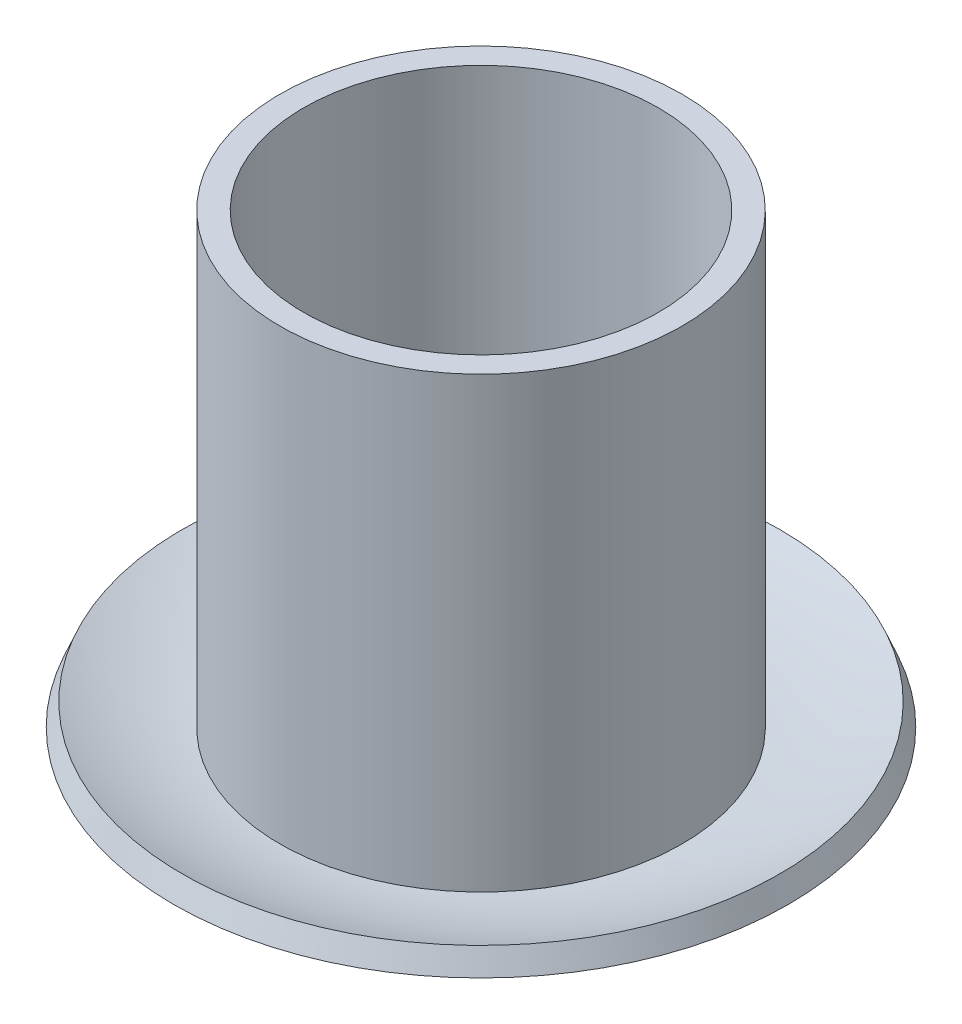
ISO-10303-21;
HEADER;
FILE_DESCRIPTION(('STEP AP214'),'2;1');
FILE_NAME('part.step','',(''),(''),'','','');
FILE_SCHEMA(('AUTOMOTIVE_DESIGN { 1 0 10303 214 1 1 1 1 }'));
ENDSEC;
DATA;
#1=APPLICATION_CONTEXT('core data for automotive mechanical design processes');
#2=APPLICATION_PROTOCOL_DEFINITION('international standard','automotive_design',2000,#1);
#3=PRODUCT_CONTEXT('',#1,'mechanical');
#4=PRODUCT('Part','Part','',(#3));
#5=PRODUCT_RELATED_PRODUCT_CATEGORY('part','',(#4));
#6=PRODUCT_DEFINITION_FORMATION('','',#4);
#7=PRODUCT_DEFINITION_CONTEXT('part definition',#1,'design');
#8=PRODUCT_DEFINITION('design','',#6,#7);
#9=PRODUCT_DEFINITION_SHAPE('','',#8);
#10=(LENGTH_UNIT() NAMED_UNIT(*) SI_UNIT(.MILLI.,.METRE.));
#11=(NAMED_UNIT(*) PLANE_ANGLE_UNIT() SI_UNIT($,.RADIAN.));
#12=(NAMED_UNIT(*) SI_UNIT($,.STERADIAN.) SOLID_ANGLE_UNIT());
#13=UNCERTAINTY_MEASURE_WITH_UNIT(LENGTH_MEASURE(1.E-05),#10,'distance_accuracy_value','');
#14=(GEOMETRIC_REPRESENTATION_CONTEXT(3) GLOBAL_UNCERTAINTY_ASSIGNED_CONTEXT((#13)) GLOBAL_UNIT_ASSIGNED_CONTEXT((#10,
#11,#12)) REPRESENTATION_CONTEXT('',''));
#15=CARTESIAN_POINT('',(0.,0.,0.));
#16=DIRECTION('',(0.,0.,1.));
#17=DIRECTION('',(1.,0.,0.));
#18=AXIS2_PLACEMENT_3D('',#15,#16,#17);
#19=CARTESIAN_POINT('',(0.,0.,0.));
#20=DIRECTION('',(0.,-1.,0.));
#21=DIRECTION('',(0.,0.,-1.));
#22=AXIS2_PLACEMENT_3D('',#19,#20,#21);
#23=CYLINDRICAL_SURFACE('',#22,1.7);
#24=CARTESIAN_POINT('',(0.,4.,0.));
#25=DIRECTION('',(0.,-1.,0.));
#26=DIRECTION('',(0.,0.,-1.));
#27=AXIS2_PLACEMENT_3D('',#24,#25,#26);
#28=CIRCLE('',#27,1.7);
#29=CARTESIAN_POINT('',(0.,4.,-1.7));
#30=VERTEX_POINT('',#29);
#31=EDGE_CURVE('E10',#30,#30,#28,.T.);
#32=ORIENTED_EDGE('',*,*,#31,.T.);
#33=EDGE_LOOP('',(#32));
#34=FACE_BOUND('',#33,.T.);
#35=CARTESIAN_POINT('',(0.,0.207347904322555,0.));
#36=DIRECTION('',(0.,-1.,0.));
#37=DIRECTION('',(0.,0.,-1.));
#38=AXIS2_PLACEMENT_3D('',#35,#36,#37);
#39=CIRCLE('',#38,1.7);
#40=CARTESIAN_POINT('',(0.,0.207347904322555,-1.7));
#41=VERTEX_POINT('',#40);
#42=EDGE_CURVE('E56',#41,#41,#39,.T.);
#43=ORIENTED_EDGE('',*,*,#42,.F.);
#44=EDGE_LOOP('',(#43));
#45=FACE_BOUND('',#44,.T.);
#46=ADVANCED_FACE('F34',(#34,#45),#23,.T.);
#47=CARTESIAN_POINT('',(1.7,4.,0.));
#48=DIRECTION('',(0.,1.,0.));
#49=DIRECTION('',(0.,0.,1.));
#50=AXIS2_PLACEMENT_3D('',#47,#48,#49);
#51=PLANE('',#50);
#52=CARTESIAN_POINT('',(0.,4.,0.));
#53=DIRECTION('',(0.,-1.,0.));
#54=DIRECTION('',(0.,0.,-1.));
#55=AXIS2_PLACEMENT_3D('',#52,#53,#54);
#56=CIRCLE('',#55,1.5);
#57=CARTESIAN_POINT('',(0.,4.,-1.5));
#58=VERTEX_POINT('',#57);
#59=EDGE_CURVE('E40',#58,#58,#56,.T.);
#60=ORIENTED_EDGE('',*,*,#59,.T.);
#61=EDGE_LOOP('',(#60));
#62=FACE_BOUND('',#61,.T.);
#63=ORIENTED_EDGE('',*,*,#31,.F.);
#64=EDGE_LOOP('',(#63));
#65=FACE_BOUND('',#64,.T.);
#66=ADVANCED_FACE('F64',(#62,#65),#51,.T.);
#67=CARTESIAN_POINT('',(0.,0.,0.));
#68=DIRECTION('',(0.,-1.,0.));
#69=DIRECTION('',(0.,0.,-1.));
#70=AXIS2_PLACEMENT_3D('',#67,#68,#69);
#71=CYLINDRICAL_SURFACE('',#70,1.5);
#72=CARTESIAN_POINT('',(0.,0.,0.));
#73=DIRECTION('',(0.,-1.,0.));
#74=DIRECTION('',(0.,0.,-1.));
#75=AXIS2_PLACEMENT_3D('',#72,#73,#74);
#76=CIRCLE('',#75,1.5);
#77=CARTESIAN_POINT('',(0.,0.,-1.5));
#78=VERTEX_POINT('',#77);
#79=EDGE_CURVE('E44',#78,#78,#76,.T.);
#80=ORIENTED_EDGE('',*,*,#79,.T.);
#81=EDGE_LOOP('',(#80));
#82=FACE_BOUND('',#81,.T.);
#83=ORIENTED_EDGE('',*,*,#59,.F.);
#84=EDGE_LOOP('',(#83));
#85=FACE_BOUND('',#84,.T.);
#86=ADVANCED_FACE('F68',(#82,#85),#71,.F.);
#87=CARTESIAN_POINT('',(0.,2.92553846237338,0.));
#88=DIRECTION('',(0.,-1.,0.));
#89=DIRECTION('',(0.,0.,-1.));
#90=AXIS2_PLACEMENT_3D('',#87,#88,#89);
#91=DEGENERATE_TOROIDAL_SURFACE('',#90,1.5,2.92553846237338,.T.);
#92=CARTESIAN_POINT('',(0.,0.214675999092366,0.));
#93=DIRECTION('',(0.,-1.,0.));
#94=DIRECTION('',(0.,0.,-1.));
#95=AXIS2_PLACEMENT_3D('',#92,#93,#94);
#96=CIRCLE('',#95,2.6);
#97=CARTESIAN_POINT('',(0.,0.214675999092366,-2.6));
#98=VERTEX_POINT('',#97);
#99=EDGE_CURVE('E48',#98,#98,#96,.T.);
#100=ORIENTED_EDGE('',*,*,#99,.T.);
#101=EDGE_LOOP('',(#100));
#102=FACE_BOUND('',#101,.T.);
#103=ORIENTED_EDGE('',*,*,#79,.F.);
#104=EDGE_LOOP('',(#103));
#105=FACE_BOUND('',#104,.T.);
#106=ADVANCED_FACE('F72',(#102,#105),#91,.T.);
#107=CARTESIAN_POINT('',(0.,0.214675999092366,0.));
#108=DIRECTION('',(0.,-1.,0.));
#109=DIRECTION('',(0.,0.,-1.));
#110=AXIS2_PLACEMENT_3D('',#107,#108,#109);
#111=CONICAL_SURFACE('',#110,2.6,0.385474821801023);
#112=CARTESIAN_POINT('',(0.,0.4,0.));
#113=DIRECTION('',(0.,-1.,0.));
#114=DIRECTION('',(0.,0.,-1.));
#115=AXIS2_PLACEMENT_3D('',#112,#113,#114);
#116=CIRCLE('',#115,2.52480016830081);
#117=CARTESIAN_POINT('',(0.,0.4,-2.52480016830081));
#118=VERTEX_POINT('',#117);
#119=EDGE_CURVE('E53',#118,#118,#116,.T.);
#120=ORIENTED_EDGE('',*,*,#119,.T.);
#121=EDGE_LOOP('',(#120));
#122=FACE_BOUND('',#121,.T.);
#123=ORIENTED_EDGE('',*,*,#99,.F.);
#124=EDGE_LOOP('',(#123));
#125=FACE_BOUND('',#124,.T.);
#126=ADVANCED_FACE('F79',(#122,#125),#111,.T.);
#127=CARTESIAN_POINT('',(0.,2.92553846237338,0.));
#128=DIRECTION('',(0.,-1.,0.));
#129=DIRECTION('',(0.,0.,-1.));
#130=AXIS2_PLACEMENT_3D('',#127,#128,#129);
#131=DEGENERATE_TOROIDAL_SURFACE('',#130,1.5,2.72553846237338,.T.);
#132=ORIENTED_EDGE('',*,*,#42,.T.);
#133=EDGE_LOOP('',(#132));
#134=FACE_BOUND('',#133,.T.);
#135=ORIENTED_EDGE('',*,*,#119,.F.);
#136=EDGE_LOOP('',(#135));
#137=FACE_BOUND('',#136,.T.);
#138=ADVANCED_FACE('F60',(#134,#137),#131,.F.);
#139=CLOSED_SHELL('',(#46,#66,#86,#106,#126,#138));
#140=MANIFOLD_SOLID_BREP('B2',#139);
#141=ADVANCED_BREP_SHAPE_REPRESENTATION('',(#18,#140),#14);
#142=SHAPE_DEFINITION_REPRESENTATION(#9,#141);
ENDSEC;
END-ISO-10303-21;
